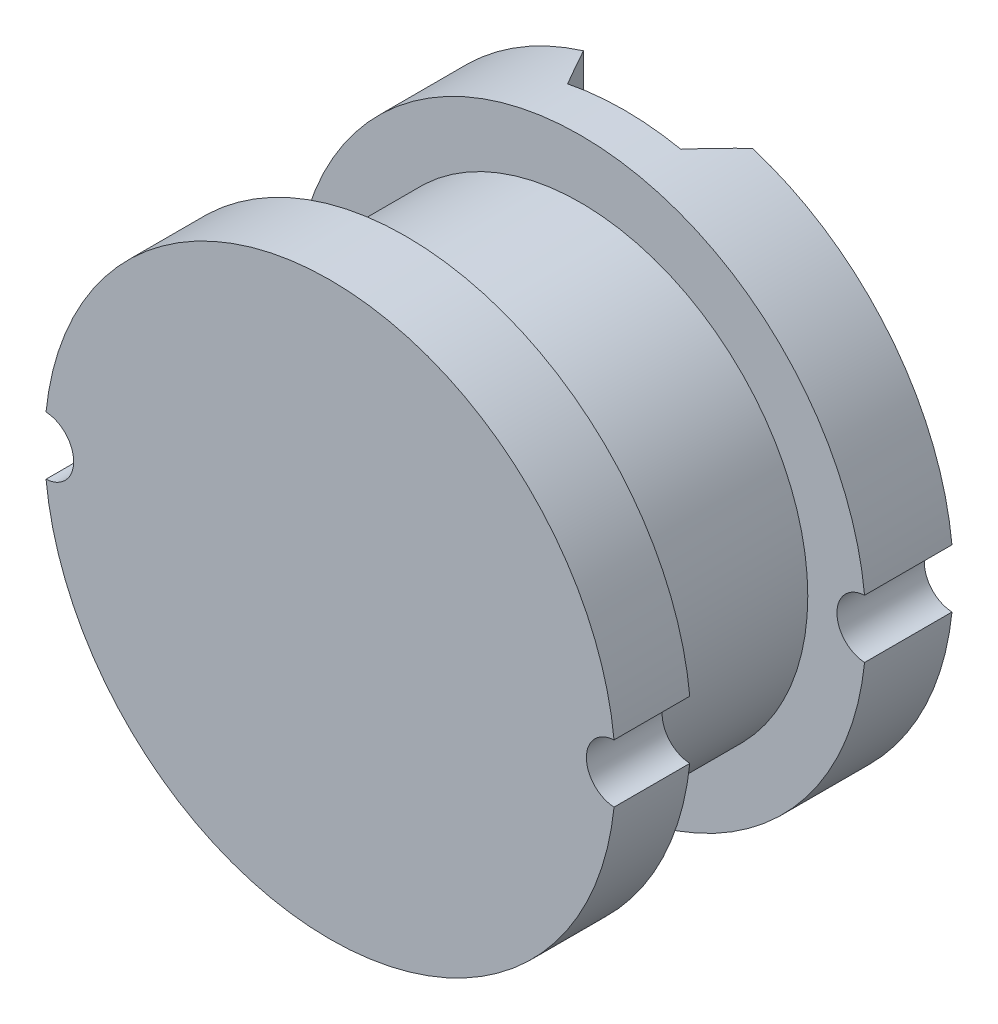
ISO-10303-21;
HEADER;
FILE_DESCRIPTION(('STEP AP214'),'2;1');
FILE_NAME('part.step','',(''),(''),'','','');
FILE_SCHEMA(('AUTOMOTIVE_DESIGN { 1 0 10303 214 1 1 1 1 }'));
ENDSEC;
DATA;
#1=APPLICATION_CONTEXT('core data for automotive mechanical design processes');
#2=APPLICATION_PROTOCOL_DEFINITION('international standard','automotive_design',2000,#1);
#3=PRODUCT_CONTEXT('',#1,'mechanical');
#4=PRODUCT('Part','Part','',(#3));
#5=PRODUCT_RELATED_PRODUCT_CATEGORY('part','',(#4));
#6=PRODUCT_DEFINITION_FORMATION('','',#4);
#7=PRODUCT_DEFINITION_CONTEXT('part definition',#1,'design');
#8=PRODUCT_DEFINITION('design','',#6,#7);
#9=PRODUCT_DEFINITION_SHAPE('','',#8);
#10=(LENGTH_UNIT() NAMED_UNIT(*) SI_UNIT(.MILLI.,.METRE.));
#11=(NAMED_UNIT(*) PLANE_ANGLE_UNIT() SI_UNIT($,.RADIAN.));
#12=(NAMED_UNIT(*) SI_UNIT($,.STERADIAN.) SOLID_ANGLE_UNIT());
#13=UNCERTAINTY_MEASURE_WITH_UNIT(LENGTH_MEASURE(1.E-05),#10,'distance_accuracy_value','');
#14=(GEOMETRIC_REPRESENTATION_CONTEXT(3) GLOBAL_UNCERTAINTY_ASSIGNED_CONTEXT((#13)) GLOBAL_UNIT_ASSIGNED_CONTEXT((#10,
#11,#12)) REPRESENTATION_CONTEXT('',''));
#15=CARTESIAN_POINT('',(0.,0.,0.));
#16=DIRECTION('',(0.,0.,1.));
#17=DIRECTION('',(1.,0.,0.));
#18=AXIS2_PLACEMENT_3D('',#15,#16,#17);
#19=CARTESIAN_POINT('',(0.,0.,1.5));
#20=DIRECTION('',(0.,0.,-1.));
#21=DIRECTION('',(-1.,0.,0.));
#22=AXIS2_PLACEMENT_3D('',#19,#20,#21);
#23=CYLINDRICAL_SURFACE('',#22,4.9);
#24=CARTESIAN_POINT('',(0.,0.,0.));
#25=DIRECTION('',(0.,0.,1.));
#26=DIRECTION('',(1.,0.,0.));
#27=AXIS2_PLACEMENT_3D('',#24,#25,#26);
#28=CIRCLE('',#27,4.9);
#29=CARTESIAN_POINT('',(1.45,-4.68054484008005,0.));
#30=VERTEX_POINT('',#29);
#31=CARTESIAN_POINT('',(4.87448979591837,-0.499348805433352,0.));
#32=VERTEX_POINT('',#31);
#33=EDGE_CURVE('E154',#30,#32,#28,.T.);
#34=ORIENTED_EDGE('',*,*,#33,.T.);
#35=DIRECTION('',(0.,0.,1.));
#36=VECTOR('',#35,1.);
#37=CARTESIAN_POINT('',(4.87448979591837,-0.499348805433351,2.9));
#38=LINE('',#37,#36);
#39=CARTESIAN_POINT('',(4.87448979591837,-0.499348805433352,1.5));
#40=VERTEX_POINT('',#39);
#41=EDGE_CURVE('E58',#32,#40,#38,.T.);
#42=ORIENTED_EDGE('',*,*,#41,.T.);
#43=CARTESIAN_POINT('',(0.,0.,1.5));
#44=DIRECTION('',(0.,0.,1.));
#45=DIRECTION('',(1.,0.,0.));
#46=AXIS2_PLACEMENT_3D('',#43,#44,#45);
#47=CIRCLE('',#46,4.9);
#48=CARTESIAN_POINT('',(-4.87448979591837,-0.499348805433351,1.5));
#49=VERTEX_POINT('',#48);
#50=EDGE_CURVE('E182',#49,#40,#47,.T.);
#51=ORIENTED_EDGE('',*,*,#50,.F.);
#52=DIRECTION('',(0.,0.,1.));
#53=VECTOR('',#52,1.);
#54=CARTESIAN_POINT('',(-4.87448979591837,-0.499348805433351,2.9));
#55=LINE('',#54,#53);
#56=CARTESIAN_POINT('',(-4.87448979591837,-0.499348805433351,0.));
#57=VERTEX_POINT('',#56);
#58=EDGE_CURVE('E221',#49,#57,#55,.F.);
#59=ORIENTED_EDGE('',*,*,#58,.T.);
#60=CARTESIAN_POINT('',(-1.45,-4.68054484008005,0.));
#61=VERTEX_POINT('',#60);
#62=EDGE_CURVE('E157',#57,#61,#28,.T.);
#63=ORIENTED_EDGE('',*,*,#62,.T.);
#64=CARTESIAN_POINT('',(0.,0.,2.27505825647404));
#65=DIRECTION('',(-0.843285938033176,0.,0.53746518651491));
#66=DIRECTION('',(-0.53746518651491,0.,-0.843285938033176));
#67=AXIS2_PLACEMENT_3D('',#64,#65,#66);
#68=ELLIPSE('',#67,9.11686956279552,4.9);
#69=CARTESIAN_POINT('',(-0.971990262488731,-4.8026279191321,0.75));
#70=VERTEX_POINT('',#69);
#71=EDGE_CURVE('E204',#61,#70,#68,.T.);
#72=ORIENTED_EDGE('',*,*,#71,.T.);
#73=CARTESIAN_POINT('',(0.,0.,0.75));
#74=DIRECTION('',(0.,0.,1.));
#75=DIRECTION('',(1.,0.,0.));
#76=AXIS2_PLACEMENT_3D('',#73,#74,#75);
#77=CIRCLE('',#76,4.9);
#78=CARTESIAN_POINT('',(0.971990262488731,-4.8026279191321,0.75));
#79=VERTEX_POINT('',#78);
#80=EDGE_CURVE('E51',#70,#79,#77,.T.);
#81=ORIENTED_EDGE('',*,*,#80,.T.);
#82=CARTESIAN_POINT('',(0.,0.,2.27505825647404));
#83=DIRECTION('',(0.843285938033176,0.,0.53746518651491));
#84=DIRECTION('',(0.53746518651491,0.,-0.843285938033176));
#85=AXIS2_PLACEMENT_3D('',#82,#83,#84);
#86=ELLIPSE('',#85,9.11686956279553,4.9);
#87=EDGE_CURVE('E206',#79,#30,#86,.T.);
#88=ORIENTED_EDGE('',*,*,#87,.T.);
#89=EDGE_LOOP('',(#34,#42,#51,#59,#63,#72,#81,#88));
#90=FACE_BOUND('',#89,.T.);
#91=ADVANCED_FACE('F43',(#90),#23,.T.);
#92=CARTESIAN_POINT('',(0.,0.,5.8));
#93=DIRECTION('',(0.,0.,-1.));
#94=DIRECTION('',(-1.,0.,0.));
#95=AXIS2_PLACEMENT_3D('',#92,#93,#94);
#96=CYLINDRICAL_SURFACE('',#95,4.9);
#97=CARTESIAN_POINT('',(0.,0.,4.5));
#98=DIRECTION('',(0.,0.,1.));
#99=DIRECTION('',(1.,0.,0.));
#100=AXIS2_PLACEMENT_3D('',#97,#98,#99);
#101=CIRCLE('',#100,4.9);
#102=CARTESIAN_POINT('',(-4.87448979591837,-0.499348805433351,4.5));
#103=VERTEX_POINT('',#102);
#104=CARTESIAN_POINT('',(4.87448979591837,-0.499348805433352,4.5));
#105=VERTEX_POINT('',#104);
#106=EDGE_CURVE('E192',#103,#105,#101,.T.);
#107=ORIENTED_EDGE('',*,*,#106,.T.);
#108=DIRECTION('',(0.,0.,1.));
#109=VECTOR('',#108,1.);
#110=CARTESIAN_POINT('',(4.87448979591837,-0.499348805433351,2.9));
#111=LINE('',#110,#109);
#112=CARTESIAN_POINT('',(4.87448979591837,-0.499348805433351,5.8));
#113=VERTEX_POINT('',#112);
#114=EDGE_CURVE('E148',#105,#113,#111,.T.);
#115=ORIENTED_EDGE('',*,*,#114,.T.);
#116=CARTESIAN_POINT('',(0.,0.,5.8));
#117=DIRECTION('',(0.,0.,1.));
#118=DIRECTION('',(1.,0.,0.));
#119=AXIS2_PLACEMENT_3D('',#116,#117,#118);
#120=CIRCLE('',#119,4.9);
#121=CARTESIAN_POINT('',(-4.87448979591837,-0.499348805433352,5.8));
#122=VERTEX_POINT('',#121);
#123=EDGE_CURVE('E190',#122,#113,#120,.T.);
#124=ORIENTED_EDGE('',*,*,#123,.F.);
#125=DIRECTION('',(0.,0.,1.));
#126=VECTOR('',#125,1.);
#127=CARTESIAN_POINT('',(-4.87448979591837,-0.499348805433351,2.9));
#128=LINE('',#127,#126);
#129=EDGE_CURVE('E229',#122,#103,#128,.F.);
#130=ORIENTED_EDGE('',*,*,#129,.T.);
#131=EDGE_LOOP('',(#107,#115,#124,#130));
#132=FACE_BOUND('',#131,.T.);
#133=ADVANCED_FACE('F248',(#132),#96,.T.);
#134=CARTESIAN_POINT('',(0.,0.,0.));
#135=DIRECTION('',(0.,0.,1.));
#136=DIRECTION('',(1.,0.,0.));
#137=AXIS2_PLACEMENT_3D('',#134,#135,#136);
#138=PLANE('',#137);
#139=ORIENTED_EDGE('',*,*,#62,.F.);
#140=CARTESIAN_POINT('',(-4.9,0.,0.));
#141=DIRECTION('',(0.,0.,1.));
#142=DIRECTION('',(1.,0.,0.));
#143=AXIS2_PLACEMENT_3D('',#140,#141,#142);
#144=CIRCLE('',#143,0.500000000000001);
#145=CARTESIAN_POINT('',(-4.87448979591837,0.499348805433351,0.));
#146=VERTEX_POINT('',#145);
#147=EDGE_CURVE('E232',#57,#146,#144,.T.);
#148=ORIENTED_EDGE('',*,*,#147,.T.);
#149=CARTESIAN_POINT('',(-1.45,4.68054484008005,0.));
#150=VERTEX_POINT('',#149);
#151=EDGE_CURVE('E161',#150,#146,#28,.T.);
#152=ORIENTED_EDGE('',*,*,#151,.F.);
#153=DIRECTION('',(0.,-1.,0.));
#154=VECTOR('',#153,1.);
#155=CARTESIAN_POINT('',(-1.45,0.,0.));
#156=LINE('',#155,#154);
#157=EDGE_CURVE('E267',#150,#61,#156,.T.);
#158=ORIENTED_EDGE('',*,*,#157,.T.);
#159=EDGE_LOOP('',(#139,#148,#152,#158));
#160=FACE_BOUND('',#159,.T.);
#161=ADVANCED_FACE('F269',(#160),#138,.F.);
#162=CARTESIAN_POINT('',(0.,0.,1.5));
#163=DIRECTION('',(0.,0.,1.));
#164=DIRECTION('',(1.,0.,0.));
#165=AXIS2_PLACEMENT_3D('',#162,#163,#164);
#166=PLANE('',#165);
#167=CARTESIAN_POINT('',(4.9,0.,1.5));
#168=DIRECTION('',(0.,0.,1.));
#169=DIRECTION('',(1.,0.,0.));
#170=AXIS2_PLACEMENT_3D('',#167,#168,#169);
#171=CIRCLE('',#170,0.500000000000001);
#172=CARTESIAN_POINT('',(4.87448979591837,0.499348805433351,1.5));
#173=VERTEX_POINT('',#172);
#174=EDGE_CURVE('E147',#173,#40,#171,.T.);
#175=ORIENTED_EDGE('',*,*,#174,.F.);
#176=CARTESIAN_POINT('',(-4.87448979591837,0.499348805433352,1.5));
#177=VERTEX_POINT('',#176);
#178=EDGE_CURVE('E146',#173,#177,#47,.T.);
#179=ORIENTED_EDGE('',*,*,#178,.T.);
#180=CARTESIAN_POINT('',(-4.9,0.,1.5));
#181=DIRECTION('',(0.,0.,1.));
#182=DIRECTION('',(1.,0.,0.));
#183=AXIS2_PLACEMENT_3D('',#180,#181,#182);
#184=CIRCLE('',#183,0.500000000000001);
#185=EDGE_CURVE('E219',#49,#177,#184,.T.);
#186=ORIENTED_EDGE('',*,*,#185,.F.);
#187=ORIENTED_EDGE('',*,*,#50,.T.);
#188=EDGE_LOOP('',(#175,#179,#186,#187));
#189=FACE_BOUND('',#188,.T.);
#190=CARTESIAN_POINT('',(0.,0.,1.5));
#191=DIRECTION('',(0.,0.,1.));
#192=DIRECTION('',(1.,0.,0.));
#193=AXIS2_PLACEMENT_3D('',#190,#191,#192);
#194=CIRCLE('',#193,3.9);
#195=CARTESIAN_POINT('',(3.9,0.,1.5));
#196=VERTEX_POINT('',#195);
#197=EDGE_CURVE('E164',#196,#196,#194,.T.);
#198=ORIENTED_EDGE('',*,*,#197,.F.);
#199=EDGE_LOOP('',(#198));
#200=FACE_BOUND('',#199,.T.);
#201=ADVANCED_FACE('F281',(#189,#200),#166,.T.);
#202=ORIENTED_EDGE('',*,*,#178,.F.);
#203=DIRECTION('',(0.,0.,1.));
#204=VECTOR('',#203,1.);
#205=CARTESIAN_POINT('',(4.87448979591837,0.499348805433351,2.9));
#206=LINE('',#205,#204);
#207=CARTESIAN_POINT('',(4.87448979591837,0.499348805433351,0.));
#208=VERTEX_POINT('',#207);
#209=EDGE_CURVE('E132',#173,#208,#206,.F.);
#210=ORIENTED_EDGE('',*,*,#209,.T.);
#211=CARTESIAN_POINT('',(1.45,4.68054484008005,0.));
#212=VERTEX_POINT('',#211);
#213=EDGE_CURVE('E143',#208,#212,#28,.T.);
#214=ORIENTED_EDGE('',*,*,#213,.T.);
#215=CARTESIAN_POINT('',(0.971990262488731,4.8026279191321,0.75));
#216=VERTEX_POINT('',#215);
#217=EDGE_CURVE('E205',#212,#216,#86,.T.);
#218=ORIENTED_EDGE('',*,*,#217,.T.);
#219=CARTESIAN_POINT('',(-0.971990262488731,4.8026279191321,0.75));
#220=VERTEX_POINT('',#219);
#221=EDGE_CURVE('E270',#216,#220,#77,.T.);
#222=ORIENTED_EDGE('',*,*,#221,.T.);
#223=EDGE_CURVE('E201',#220,#150,#68,.T.);
#224=ORIENTED_EDGE('',*,*,#223,.T.);
#225=ORIENTED_EDGE('',*,*,#151,.T.);
#226=DIRECTION('',(0.,0.,1.));
#227=VECTOR('',#226,1.);
#228=CARTESIAN_POINT('',(-4.87448979591837,0.499348805433351,2.9));
#229=LINE('',#228,#227);
#230=EDGE_CURVE('E215',#146,#177,#229,.T.);
#231=ORIENTED_EDGE('',*,*,#230,.T.);
#232=EDGE_LOOP('',(#202,#210,#214,#218,#222,#224,#225,#231));
#233=FACE_BOUND('',#232,.T.);
#234=ADVANCED_FACE('F45',(#233),#23,.T.);
#235=ORIENTED_EDGE('',*,*,#213,.F.);
#236=CARTESIAN_POINT('',(4.9,0.,0.));
#237=DIRECTION('',(0.,0.,1.));
#238=DIRECTION('',(1.,0.,0.));
#239=AXIS2_PLACEMENT_3D('',#236,#237,#238);
#240=CIRCLE('',#239,0.500000000000001);
#241=EDGE_CURVE('E129',#208,#32,#240,.T.);
#242=ORIENTED_EDGE('',*,*,#241,.T.);
#243=ORIENTED_EDGE('',*,*,#33,.F.);
#244=DIRECTION('',(0.,1.,0.));
#245=VECTOR('',#244,1.);
#246=CARTESIAN_POINT('',(1.45,0.,0.));
#247=LINE('',#246,#245);
#248=EDGE_CURVE('E152',#30,#212,#247,.T.);
#249=ORIENTED_EDGE('',*,*,#248,.T.);
#250=EDGE_LOOP('',(#235,#242,#243,#249));
#251=FACE_BOUND('',#250,.T.);
#252=ADVANCED_FACE('F151',(#251),#138,.F.);
#253=CARTESIAN_POINT('',(0.,0.,4.5));
#254=DIRECTION('',(0.,0.,-1.));
#255=DIRECTION('',(-1.,0.,0.));
#256=AXIS2_PLACEMENT_3D('',#253,#254,#255);
#257=CYLINDRICAL_SURFACE('',#256,3.9);
#258=CARTESIAN_POINT('',(0.,0.,4.5));
#259=DIRECTION('',(0.,0.,1.));
#260=DIRECTION('',(1.,0.,0.));
#261=AXIS2_PLACEMENT_3D('',#258,#259,#260);
#262=CIRCLE('',#261,3.9);
#263=CARTESIAN_POINT('',(3.9,0.,4.5));
#264=VERTEX_POINT('',#263);
#265=EDGE_CURVE('E155',#264,#264,#262,.T.);
#266=ORIENTED_EDGE('',*,*,#265,.F.);
#267=EDGE_LOOP('',(#266));
#268=FACE_BOUND('',#267,.T.);
#269=ORIENTED_EDGE('',*,*,#197,.T.);
#270=EDGE_LOOP('',(#269));
#271=FACE_BOUND('',#270,.T.);
#272=ADVANCED_FACE('F304',(#268,#271),#257,.T.);
#273=CARTESIAN_POINT('',(0.,0.,4.5));
#274=DIRECTION('',(0.,0.,1.));
#275=DIRECTION('',(1.,0.,0.));
#276=AXIS2_PLACEMENT_3D('',#273,#274,#275);
#277=PLANE('',#276);
#278=CARTESIAN_POINT('',(4.87448979591837,0.49934880543335,4.5));
#279=VERTEX_POINT('',#278);
#280=CARTESIAN_POINT('',(-4.87448979591837,0.499348805433352,4.5));
#281=VERTEX_POINT('',#280);
#282=EDGE_CURVE('E197',#279,#281,#101,.T.);
#283=ORIENTED_EDGE('',*,*,#282,.F.);
#284=CARTESIAN_POINT('',(4.9,0.,4.5));
#285=DIRECTION('',(0.,0.,1.));
#286=DIRECTION('',(1.,0.,0.));
#287=AXIS2_PLACEMENT_3D('',#284,#285,#286);
#288=CIRCLE('',#287,0.500000000000001);
#289=EDGE_CURVE('E239',#279,#105,#288,.T.);
#290=ORIENTED_EDGE('',*,*,#289,.T.);
#291=ORIENTED_EDGE('',*,*,#106,.F.);
#292=CARTESIAN_POINT('',(-4.9,0.,4.5));
#293=DIRECTION('',(0.,0.,1.));
#294=DIRECTION('',(1.,0.,0.));
#295=AXIS2_PLACEMENT_3D('',#292,#293,#294);
#296=CIRCLE('',#295,0.500000000000001);
#297=EDGE_CURVE('E226',#103,#281,#296,.T.);
#298=ORIENTED_EDGE('',*,*,#297,.T.);
#299=EDGE_LOOP('',(#283,#290,#291,#298));
#300=FACE_BOUND('',#299,.T.);
#301=ORIENTED_EDGE('',*,*,#265,.T.);
#302=EDGE_LOOP('',(#301));
#303=FACE_BOUND('',#302,.T.);
#304=ADVANCED_FACE('F311',(#300,#303),#277,.F.);
#305=CARTESIAN_POINT('',(4.87448979591837,0.499348805433352,5.8));
#306=VERTEX_POINT('',#305);
#307=CARTESIAN_POINT('',(-4.87448979591837,0.499348805433351,5.8));
#308=VERTEX_POINT('',#307);
#309=EDGE_CURVE('E196',#306,#308,#120,.T.);
#310=ORIENTED_EDGE('',*,*,#309,.F.);
#311=DIRECTION('',(0.,0.,1.));
#312=VECTOR('',#311,1.);
#313=CARTESIAN_POINT('',(4.87448979591837,0.499348805433351,2.9));
#314=LINE('',#313,#312);
#315=EDGE_CURVE('E66',#306,#279,#314,.F.);
#316=ORIENTED_EDGE('',*,*,#315,.T.);
#317=ORIENTED_EDGE('',*,*,#282,.T.);
#318=DIRECTION('',(0.,0.,1.));
#319=VECTOR('',#318,1.);
#320=CARTESIAN_POINT('',(-4.87448979591837,0.499348805433351,2.9));
#321=LINE('',#320,#319);
#322=EDGE_CURVE('E223',#281,#308,#321,.T.);
#323=ORIENTED_EDGE('',*,*,#322,.T.);
#324=EDGE_LOOP('',(#310,#316,#317,#323));
#325=FACE_BOUND('',#324,.T.);
#326=ADVANCED_FACE('F256',(#325),#96,.T.);
#327=CARTESIAN_POINT('',(0.,0.,5.8));
#328=DIRECTION('',(0.,0.,1.));
#329=DIRECTION('',(1.,0.,0.));
#330=AXIS2_PLACEMENT_3D('',#327,#328,#329);
#331=PLANE('',#330);
#332=CARTESIAN_POINT('',(4.9,0.,5.8));
#333=DIRECTION('',(0.,0.,1.));
#334=DIRECTION('',(1.,0.,0.));
#335=AXIS2_PLACEMENT_3D('',#332,#333,#334);
#336=CIRCLE('',#335,0.500000000000001);
#337=EDGE_CURVE('E138',#306,#113,#336,.T.);
#338=ORIENTED_EDGE('',*,*,#337,.F.);
#339=ORIENTED_EDGE('',*,*,#309,.T.);
#340=CARTESIAN_POINT('',(-4.9,0.,5.8));
#341=DIRECTION('',(0.,0.,1.));
#342=DIRECTION('',(1.,0.,0.));
#343=AXIS2_PLACEMENT_3D('',#340,#341,#342);
#344=CIRCLE('',#343,0.500000000000001);
#345=EDGE_CURVE('E11',#122,#308,#344,.T.);
#346=ORIENTED_EDGE('',*,*,#345,.F.);
#347=ORIENTED_EDGE('',*,*,#123,.T.);
#348=EDGE_LOOP('',(#338,#339,#346,#347));
#349=FACE_BOUND('',#348,.T.);
#350=ADVANCED_FACE('F251',(#349),#331,.T.);
#351=CARTESIAN_POINT('',(0.971990262488731,-4.9,0.75));
#352=DIRECTION('',(0.,0.,1.));
#353=DIRECTION('',(1.,0.,0.));
#354=AXIS2_PLACEMENT_3D('',#351,#352,#353);
#355=PLANE('',#354);
#356=DIRECTION('',(0.,1.,0.));
#357=VECTOR('',#356,1.);
#358=CARTESIAN_POINT('',(0.971990262488731,-4.9,0.75));
#359=LINE('',#358,#357);
#360=EDGE_CURVE('E211',#79,#216,#359,.T.);
#361=ORIENTED_EDGE('',*,*,#360,.F.);
#362=ORIENTED_EDGE('',*,*,#80,.F.);
#363=DIRECTION('',(0.,1.,0.));
#364=VECTOR('',#363,1.);
#365=CARTESIAN_POINT('',(-0.971990262488731,-4.9,0.75));
#366=LINE('',#365,#364);
#367=EDGE_CURVE('E210',#70,#220,#366,.T.);
#368=ORIENTED_EDGE('',*,*,#367,.T.);
#369=ORIENTED_EDGE('',*,*,#221,.F.);
#370=EDGE_LOOP('',(#361,#362,#368,#369));
#371=FACE_BOUND('',#370,.T.);
#372=ADVANCED_FACE('F277',(#371),#355,.F.);
#373=CARTESIAN_POINT('',(-1.45,-4.9,0.));
#374=DIRECTION('',(-0.843285938033176,0.,0.53746518651491));
#375=DIRECTION('',(0.53746518651491,0.,0.843285938033176));
#376=AXIS2_PLACEMENT_3D('',#373,#374,#375);
#377=PLANE('',#376);
#378=ORIENTED_EDGE('',*,*,#157,.F.);
#379=ORIENTED_EDGE('',*,*,#223,.F.);
#380=ORIENTED_EDGE('',*,*,#367,.F.);
#381=ORIENTED_EDGE('',*,*,#71,.F.);
#382=EDGE_LOOP('',(#378,#379,#380,#381));
#383=FACE_BOUND('',#382,.T.);
#384=ADVANCED_FACE('F266',(#383),#377,.F.);
#385=CARTESIAN_POINT('',(1.45,-4.9,0.));
#386=DIRECTION('',(0.843285938033176,0.,0.53746518651491));
#387=DIRECTION('',(0.53746518651491,0.,-0.843285938033176));
#388=AXIS2_PLACEMENT_3D('',#385,#386,#387);
#389=PLANE('',#388);
#390=ORIENTED_EDGE('',*,*,#248,.F.);
#391=ORIENTED_EDGE('',*,*,#87,.F.);
#392=ORIENTED_EDGE('',*,*,#360,.T.);
#393=ORIENTED_EDGE('',*,*,#217,.F.);
#394=EDGE_LOOP('',(#390,#391,#392,#393));
#395=FACE_BOUND('',#394,.T.);
#396=ADVANCED_FACE('F279',(#395),#389,.F.);
#397=CARTESIAN_POINT('',(-4.9,0.,0.));
#398=DIRECTION('',(0.,0.,1.));
#399=DIRECTION('',(1.,0.,0.));
#400=AXIS2_PLACEMENT_3D('',#397,#398,#399);
#401=CYLINDRICAL_SURFACE('',#400,0.500000000000001);
#402=ORIENTED_EDGE('',*,*,#297,.F.);
#403=ORIENTED_EDGE('',*,*,#129,.F.);
#404=ORIENTED_EDGE('',*,*,#345,.T.);
#405=ORIENTED_EDGE('',*,*,#322,.F.);
#406=EDGE_LOOP('',(#402,#403,#404,#405));
#407=FACE_BOUND('',#406,.T.);
#408=ADVANCED_FACE('F254',(#407),#401,.F.);
#409=ORIENTED_EDGE('',*,*,#147,.F.);
#410=ORIENTED_EDGE('',*,*,#58,.F.);
#411=ORIENTED_EDGE('',*,*,#185,.T.);
#412=ORIENTED_EDGE('',*,*,#230,.F.);
#413=EDGE_LOOP('',(#409,#410,#411,#412));
#414=FACE_BOUND('',#413,.T.);
#415=ADVANCED_FACE('F284',(#414),#401,.F.);
#416=CARTESIAN_POINT('',(4.9,0.,0.));
#417=DIRECTION('',(0.,0.,1.));
#418=DIRECTION('',(1.,0.,0.));
#419=AXIS2_PLACEMENT_3D('',#416,#417,#418);
#420=CYLINDRICAL_SURFACE('',#419,0.500000000000001);
#421=ORIENTED_EDGE('',*,*,#289,.F.);
#422=ORIENTED_EDGE('',*,*,#315,.F.);
#423=ORIENTED_EDGE('',*,*,#337,.T.);
#424=ORIENTED_EDGE('',*,*,#114,.F.);
#425=EDGE_LOOP('',(#421,#422,#423,#424));
#426=FACE_BOUND('',#425,.T.);
#427=ADVANCED_FACE('F243',(#426),#420,.F.);
#428=ORIENTED_EDGE('',*,*,#241,.F.);
#429=ORIENTED_EDGE('',*,*,#209,.F.);
#430=ORIENTED_EDGE('',*,*,#174,.T.);
#431=ORIENTED_EDGE('',*,*,#41,.F.);
#432=EDGE_LOOP('',(#428,#429,#430,#431));
#433=FACE_BOUND('',#432,.T.);
#434=ADVANCED_FACE('F131',(#433),#420,.F.);
#435=CLOSED_SHELL('',(#91,#133,#161,#201,#234,#252,#272,#304,#326,#350,#372,#384,#396,#408,#415,
#427,#434));
#436=MANIFOLD_SOLID_BREP('B2',#435);
#437=ADVANCED_BREP_SHAPE_REPRESENTATION('',(#18,#436),#14);
#438=SHAPE_DEFINITION_REPRESENTATION(#9,#437);
ENDSEC;
END-ISO-10303-21;
